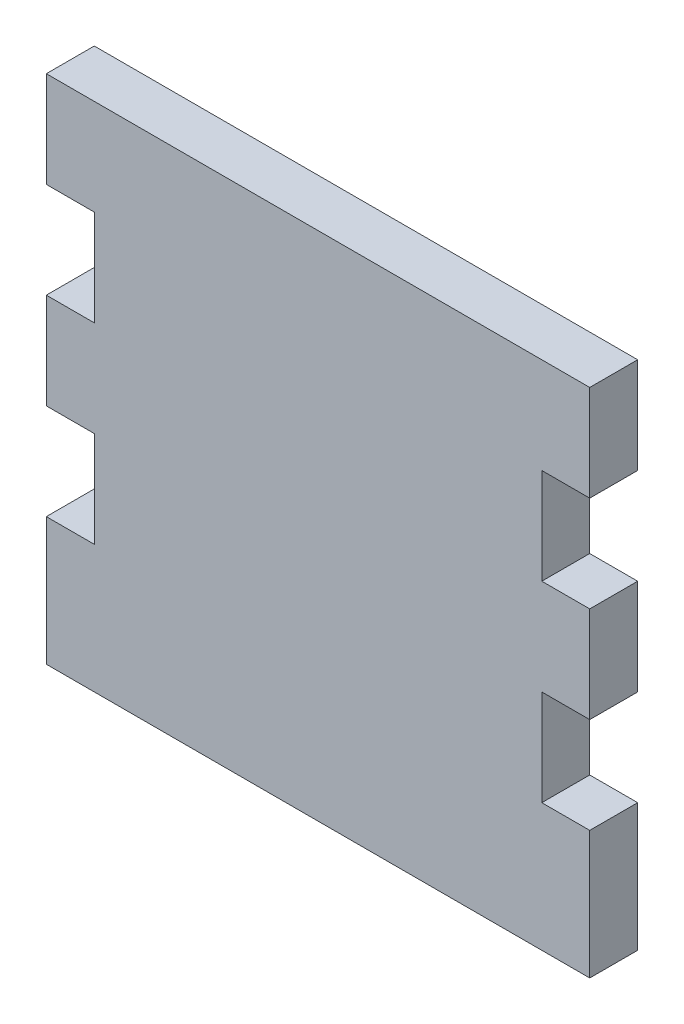
ISO-10303-21;
HEADER;
FILE_DESCRIPTION(('STEP AP214'),'2;1');
FILE_NAME('part.step','',(''),(''),'','','');
FILE_SCHEMA(('AUTOMOTIVE_DESIGN { 1 0 10303 214 1 1 1 1 }'));
ENDSEC;
DATA;
#1=APPLICATION_CONTEXT('core data for automotive mechanical design processes');
#2=APPLICATION_PROTOCOL_DEFINITION('international standard','automotive_design',2000,#1);
#3=PRODUCT_CONTEXT('',#1,'mechanical');
#4=PRODUCT('Part','Part','',(#3));
#5=PRODUCT_RELATED_PRODUCT_CATEGORY('part','',(#4));
#6=PRODUCT_DEFINITION_FORMATION('','',#4);
#7=PRODUCT_DEFINITION_CONTEXT('part definition',#1,'design');
#8=PRODUCT_DEFINITION('design','',#6,#7);
#9=PRODUCT_DEFINITION_SHAPE('','',#8);
#10=(LENGTH_UNIT() NAMED_UNIT(*) SI_UNIT(.MILLI.,.METRE.));
#11=(NAMED_UNIT(*) PLANE_ANGLE_UNIT() SI_UNIT($,.RADIAN.));
#12=(NAMED_UNIT(*) SI_UNIT($,.STERADIAN.) SOLID_ANGLE_UNIT());
#13=UNCERTAINTY_MEASURE_WITH_UNIT(LENGTH_MEASURE(1.E-05),#10,'distance_accuracy_value','');
#14=(GEOMETRIC_REPRESENTATION_CONTEXT(3) GLOBAL_UNCERTAINTY_ASSIGNED_CONTEXT((#13)) GLOBAL_UNIT_ASSIGNED_CONTEXT((#10,
#11,#12)) REPRESENTATION_CONTEXT('',''));
#15=CARTESIAN_POINT('',(0.,0.,0.));
#16=DIRECTION('',(0.,0.,1.));
#17=DIRECTION('',(1.,0.,0.));
#18=AXIS2_PLACEMENT_3D('',#15,#16,#17);
#19=CARTESIAN_POINT('',(-397.263152268225,249.589998968711,15.));
#20=DIRECTION('',(1.,0.,0.));
#21=DIRECTION('',(0.,0.,-1.));
#22=AXIS2_PLACEMENT_3D('',#19,#20,#21);
#23=PLANE('',#22);
#24=DIRECTION('',(0.,-1.,0.));
#25=VECTOR('',#24,1.);
#26=CARTESIAN_POINT('',(-397.263152268225,249.589998968711,0.));
#27=LINE('',#26,#25);
#28=CARTESIAN_POINT('',(-397.263152268225,249.589998968711,0.));
#29=VERTEX_POINT('',#28);
#30=CARTESIAN_POINT('',(-397.263152268225,209.589998968711,0.));
#31=VERTEX_POINT('',#30);
#32=EDGE_CURVE('E203',#29,#31,#27,.T.);
#33=ORIENTED_EDGE('',*,*,#32,.T.);
#34=DIRECTION('',(0.,0.,-1.));
#35=VECTOR('',#34,1.);
#36=CARTESIAN_POINT('',(-397.263152268225,209.589998968711,15.));
#37=LINE('',#36,#35);
#38=CARTESIAN_POINT('',(-397.263152268225,209.589998968711,15.));
#39=VERTEX_POINT('',#38);
#40=EDGE_CURVE('E11',#39,#31,#37,.T.);
#41=ORIENTED_EDGE('',*,*,#40,.F.);
#42=DIRECTION('',(0.,-1.,0.));
#43=VECTOR('',#42,1.);
#44=CARTESIAN_POINT('',(-397.263152268225,249.589998968711,15.));
#45=LINE('',#44,#43);
#46=CARTESIAN_POINT('',(-397.263152268225,249.589998968711,15.));
#47=VERTEX_POINT('',#46);
#48=EDGE_CURVE('E241',#47,#39,#45,.T.);
#49=ORIENTED_EDGE('',*,*,#48,.F.);
#50=DIRECTION('',(0.,0.,-1.));
#51=VECTOR('',#50,1.);
#52=CARTESIAN_POINT('',(-397.263152268225,249.589998968711,15.));
#53=LINE('',#52,#51);
#54=EDGE_CURVE('E199',#47,#29,#53,.T.);
#55=ORIENTED_EDGE('',*,*,#54,.T.);
#56=EDGE_LOOP('',(#33,#41,#49,#55));
#57=FACE_BOUND('',#56,.T.);
#58=ADVANCED_FACE('F35',(#57),#23,.F.);
#59=CARTESIAN_POINT('',(-397.263152268225,209.589998968711,15.));
#60=DIRECTION('',(0.,1.,0.));
#61=DIRECTION('',(0.,0.,1.));
#62=AXIS2_PLACEMENT_3D('',#59,#60,#61);
#63=PLANE('',#62);
#64=DIRECTION('',(1.,0.,0.));
#65=VECTOR('',#64,1.);
#66=CARTESIAN_POINT('',(-397.263152268225,209.589998968711,0.));
#67=LINE('',#66,#65);
#68=CARTESIAN_POINT('',(-227.263152268225,209.589998968711,0.));
#69=VERTEX_POINT('',#68);
#70=EDGE_CURVE('E206',#31,#69,#67,.T.);
#71=ORIENTED_EDGE('',*,*,#70,.T.);
#72=DIRECTION('',(0.,0.,-1.));
#73=VECTOR('',#72,1.);
#74=CARTESIAN_POINT('',(-227.263152268225,209.589998968711,15.));
#75=LINE('',#74,#73);
#76=CARTESIAN_POINT('',(-227.263152268225,209.589998968711,15.));
#77=VERTEX_POINT('',#76);
#78=EDGE_CURVE('E43',#77,#69,#75,.T.);
#79=ORIENTED_EDGE('',*,*,#78,.F.);
#80=DIRECTION('',(1.,0.,0.));
#81=VECTOR('',#80,1.);
#82=CARTESIAN_POINT('',(-397.263152268225,209.589998968711,15.));
#83=LINE('',#82,#81);
#84=EDGE_CURVE('E130',#39,#77,#83,.T.);
#85=ORIENTED_EDGE('',*,*,#84,.F.);
#86=ORIENTED_EDGE('',*,*,#40,.T.);
#87=EDGE_LOOP('',(#71,#79,#85,#86));
#88=FACE_BOUND('',#87,.T.);
#89=ADVANCED_FACE('F359',(#88),#63,.F.);
#90=CARTESIAN_POINT('',(-227.263152268225,209.589998968711,15.));
#91=DIRECTION('',(-1.,0.,0.));
#92=DIRECTION('',(0.,-1.,0.));
#93=AXIS2_PLACEMENT_3D('',#90,#91,#92);
#94=PLANE('',#93);
#95=DIRECTION('',(0.,1.,0.));
#96=VECTOR('',#95,1.);
#97=CARTESIAN_POINT('',(-227.263152268225,209.589998968711,0.));
#98=LINE('',#97,#96);
#99=CARTESIAN_POINT('',(-227.263152268225,249.589998968711,0.));
#100=VERTEX_POINT('',#99);
#101=EDGE_CURVE('E208',#69,#100,#98,.T.);
#102=ORIENTED_EDGE('',*,*,#101,.T.);
#103=DIRECTION('',(0.,0.,-1.));
#104=VECTOR('',#103,1.);
#105=CARTESIAN_POINT('',(-227.263152268225,249.589998968711,15.));
#106=LINE('',#105,#104);
#107=CARTESIAN_POINT('',(-227.263152268225,249.589998968711,15.));
#108=VERTEX_POINT('',#107);
#109=EDGE_CURVE('E284',#108,#100,#106,.T.);
#110=ORIENTED_EDGE('',*,*,#109,.F.);
#111=DIRECTION('',(0.,1.,0.));
#112=VECTOR('',#111,1.);
#113=CARTESIAN_POINT('',(-227.263152268225,209.589998968711,15.));
#114=LINE('',#113,#112);
#115=EDGE_CURVE('E292',#77,#108,#114,.T.);
#116=ORIENTED_EDGE('',*,*,#115,.F.);
#117=ORIENTED_EDGE('',*,*,#78,.T.);
#118=EDGE_LOOP('',(#102,#110,#116,#117));
#119=FACE_BOUND('',#118,.T.);
#120=ADVANCED_FACE('F290',(#119),#94,.F.);
#121=CARTESIAN_POINT('',(-227.263152268225,249.589998968711,15.));
#122=DIRECTION('',(0.,-1.,0.));
#123=DIRECTION('',(0.,0.,-1.));
#124=AXIS2_PLACEMENT_3D('',#121,#122,#123);
#125=PLANE('',#124);
#126=DIRECTION('',(-1.,0.,0.));
#127=VECTOR('',#126,1.);
#128=CARTESIAN_POINT('',(-227.263152268225,249.589998968711,0.));
#129=LINE('',#128,#127);
#130=CARTESIAN_POINT('',(-242.263152268225,249.589998968711,0.));
#131=VERTEX_POINT('',#130);
#132=EDGE_CURVE('E210',#100,#131,#129,.T.);
#133=ORIENTED_EDGE('',*,*,#132,.T.);
#134=DIRECTION('',(0.,0.,-1.));
#135=VECTOR('',#134,1.);
#136=CARTESIAN_POINT('',(-242.263152268225,249.589998968711,15.));
#137=LINE('',#136,#135);
#138=CARTESIAN_POINT('',(-242.263152268225,249.589998968711,15.));
#139=VERTEX_POINT('',#138);
#140=EDGE_CURVE('E281',#139,#131,#137,.T.);
#141=ORIENTED_EDGE('',*,*,#140,.F.);
#142=DIRECTION('',(-1.,0.,0.));
#143=VECTOR('',#142,1.);
#144=CARTESIAN_POINT('',(-227.263152268225,249.589998968711,15.));
#145=LINE('',#144,#143);
#146=EDGE_CURVE('E310',#108,#139,#145,.T.);
#147=ORIENTED_EDGE('',*,*,#146,.F.);
#148=ORIENTED_EDGE('',*,*,#109,.T.);
#149=EDGE_LOOP('',(#133,#141,#147,#148));
#150=FACE_BOUND('',#149,.T.);
#151=ADVANCED_FACE('F301',(#150),#125,.F.);
#152=CARTESIAN_POINT('',(-242.263152268225,249.589998968711,15.));
#153=DIRECTION('',(-1.,0.,0.));
#154=DIRECTION('',(0.,0.,1.));
#155=AXIS2_PLACEMENT_3D('',#152,#153,#154);
#156=PLANE('',#155);
#157=DIRECTION('',(0.,1.,0.));
#158=VECTOR('',#157,1.);
#159=CARTESIAN_POINT('',(-242.263152268225,249.589998968711,0.));
#160=LINE('',#159,#158);
#161=CARTESIAN_POINT('',(-242.263152268225,279.589998968711,0.));
#162=VERTEX_POINT('',#161);
#163=EDGE_CURVE('E212',#131,#162,#160,.T.);
#164=ORIENTED_EDGE('',*,*,#163,.T.);
#165=DIRECTION('',(0.,0.,-1.));
#166=VECTOR('',#165,1.);
#167=CARTESIAN_POINT('',(-242.263152268225,279.589998968711,15.));
#168=LINE('',#167,#166);
#169=CARTESIAN_POINT('',(-242.263152268225,279.589998968711,15.));
#170=VERTEX_POINT('',#169);
#171=EDGE_CURVE('E278',#170,#162,#168,.T.);
#172=ORIENTED_EDGE('',*,*,#171,.F.);
#173=DIRECTION('',(0.,1.,0.));
#174=VECTOR('',#173,1.);
#175=CARTESIAN_POINT('',(-242.263152268225,249.589998968711,15.));
#176=LINE('',#175,#174);
#177=EDGE_CURVE('E307',#139,#170,#176,.T.);
#178=ORIENTED_EDGE('',*,*,#177,.F.);
#179=ORIENTED_EDGE('',*,*,#140,.T.);
#180=EDGE_LOOP('',(#164,#172,#178,#179));
#181=FACE_BOUND('',#180,.T.);
#182=ADVANCED_FACE('F305',(#181),#156,.F.);
#183=CARTESIAN_POINT('',(-242.263152268225,279.589998968711,15.));
#184=DIRECTION('',(0.,1.,0.));
#185=DIRECTION('',(0.,0.,1.));
#186=AXIS2_PLACEMENT_3D('',#183,#184,#185);
#187=PLANE('',#186);
#188=DIRECTION('',(1.,0.,0.));
#189=VECTOR('',#188,1.);
#190=CARTESIAN_POINT('',(-242.263152268225,279.589998968711,0.));
#191=LINE('',#190,#189);
#192=CARTESIAN_POINT('',(-227.263152268225,279.589998968711,0.));
#193=VERTEX_POINT('',#192);
#194=EDGE_CURVE('E214',#162,#193,#191,.T.);
#195=ORIENTED_EDGE('',*,*,#194,.T.);
#196=DIRECTION('',(0.,0.,-1.));
#197=VECTOR('',#196,1.);
#198=CARTESIAN_POINT('',(-227.263152268225,279.589998968711,15.));
#199=LINE('',#198,#197);
#200=CARTESIAN_POINT('',(-227.263152268225,279.589998968711,15.));
#201=VERTEX_POINT('',#200);
#202=EDGE_CURVE('E275',#201,#193,#199,.T.);
#203=ORIENTED_EDGE('',*,*,#202,.F.);
#204=DIRECTION('',(1.,0.,0.));
#205=VECTOR('',#204,1.);
#206=CARTESIAN_POINT('',(-242.263152268225,279.589998968711,15.));
#207=LINE('',#206,#205);
#208=EDGE_CURVE('E309',#170,#201,#207,.T.);
#209=ORIENTED_EDGE('',*,*,#208,.F.);
#210=ORIENTED_EDGE('',*,*,#171,.T.);
#211=EDGE_LOOP('',(#195,#203,#209,#210));
#212=FACE_BOUND('',#211,.T.);
#213=ADVANCED_FACE('F372',(#212),#187,.F.);
#214=CARTESIAN_POINT('',(-227.263152268225,279.589998968711,15.));
#215=DIRECTION('',(-1.,0.,0.));
#216=DIRECTION('',(0.,0.,1.));
#217=AXIS2_PLACEMENT_3D('',#214,#215,#216);
#218=PLANE('',#217);
#219=DIRECTION('',(0.,1.,0.));
#220=VECTOR('',#219,1.);
#221=CARTESIAN_POINT('',(-227.263152268225,279.589998968711,0.));
#222=LINE('',#221,#220);
#223=CARTESIAN_POINT('',(-227.263152268225,309.589998968711,0.));
#224=VERTEX_POINT('',#223);
#225=EDGE_CURVE('E216',#193,#224,#222,.T.);
#226=ORIENTED_EDGE('',*,*,#225,.T.);
#227=DIRECTION('',(0.,0.,-1.));
#228=VECTOR('',#227,1.);
#229=CARTESIAN_POINT('',(-227.263152268225,309.589998968711,15.));
#230=LINE('',#229,#228);
#231=CARTESIAN_POINT('',(-227.263152268225,309.589998968711,15.));
#232=VERTEX_POINT('',#231);
#233=EDGE_CURVE('E272',#232,#224,#230,.T.);
#234=ORIENTED_EDGE('',*,*,#233,.F.);
#235=DIRECTION('',(0.,1.,0.));
#236=VECTOR('',#235,1.);
#237=CARTESIAN_POINT('',(-227.263152268225,279.589998968711,15.));
#238=LINE('',#237,#236);
#239=EDGE_CURVE('E312',#201,#232,#238,.T.);
#240=ORIENTED_EDGE('',*,*,#239,.F.);
#241=ORIENTED_EDGE('',*,*,#202,.T.);
#242=EDGE_LOOP('',(#226,#234,#240,#241));
#243=FACE_BOUND('',#242,.T.);
#244=ADVANCED_FACE('F375',(#243),#218,.F.);
#245=CARTESIAN_POINT('',(-227.263152268225,309.589998968711,15.));
#246=DIRECTION('',(0.,-1.,0.));
#247=DIRECTION('',(0.,0.,-1.));
#248=AXIS2_PLACEMENT_3D('',#245,#246,#247);
#249=PLANE('',#248);
#250=DIRECTION('',(-1.,0.,0.));
#251=VECTOR('',#250,1.);
#252=CARTESIAN_POINT('',(-227.263152268225,309.589998968711,0.));
#253=LINE('',#252,#251);
#254=CARTESIAN_POINT('',(-242.263152268225,309.589998968711,0.));
#255=VERTEX_POINT('',#254);
#256=EDGE_CURVE('E218',#224,#255,#253,.T.);
#257=ORIENTED_EDGE('',*,*,#256,.T.);
#258=DIRECTION('',(0.,0.,-1.));
#259=VECTOR('',#258,1.);
#260=CARTESIAN_POINT('',(-242.263152268225,309.589998968711,15.));
#261=LINE('',#260,#259);
#262=CARTESIAN_POINT('',(-242.263152268225,309.589998968711,15.));
#263=VERTEX_POINT('',#262);
#264=EDGE_CURVE('E269',#263,#255,#261,.T.);
#265=ORIENTED_EDGE('',*,*,#264,.F.);
#266=DIRECTION('',(-1.,0.,0.));
#267=VECTOR('',#266,1.);
#268=CARTESIAN_POINT('',(-227.263152268225,309.589998968711,15.));
#269=LINE('',#268,#267);
#270=EDGE_CURVE('E318',#232,#263,#269,.T.);
#271=ORIENTED_EDGE('',*,*,#270,.F.);
#272=ORIENTED_EDGE('',*,*,#233,.T.);
#273=EDGE_LOOP('',(#257,#265,#271,#272));
#274=FACE_BOUND('',#273,.T.);
#275=ADVANCED_FACE('F379',(#274),#249,.F.);
#276=CARTESIAN_POINT('',(-242.263152268225,309.589998968711,15.));
#277=DIRECTION('',(-1.,0.,0.));
#278=DIRECTION('',(0.,0.,1.));
#279=AXIS2_PLACEMENT_3D('',#276,#277,#278);
#280=PLANE('',#279);
#281=DIRECTION('',(0.,1.,0.));
#282=VECTOR('',#281,1.);
#283=CARTESIAN_POINT('',(-242.263152268225,309.589998968711,0.));
#284=LINE('',#283,#282);
#285=CARTESIAN_POINT('',(-242.263152268225,339.589998968711,0.));
#286=VERTEX_POINT('',#285);
#287=EDGE_CURVE('E220',#255,#286,#284,.T.);
#288=ORIENTED_EDGE('',*,*,#287,.T.);
#289=DIRECTION('',(0.,0.,-1.));
#290=VECTOR('',#289,1.);
#291=CARTESIAN_POINT('',(-242.263152268225,339.589998968711,15.));
#292=LINE('',#291,#290);
#293=CARTESIAN_POINT('',(-242.263152268225,339.589998968711,15.));
#294=VERTEX_POINT('',#293);
#295=EDGE_CURVE('E266',#294,#286,#292,.T.);
#296=ORIENTED_EDGE('',*,*,#295,.F.);
#297=DIRECTION('',(0.,1.,0.));
#298=VECTOR('',#297,1.);
#299=CARTESIAN_POINT('',(-242.263152268225,309.589998968711,15.));
#300=LINE('',#299,#298);
#301=EDGE_CURVE('E320',#263,#294,#300,.T.);
#302=ORIENTED_EDGE('',*,*,#301,.F.);
#303=ORIENTED_EDGE('',*,*,#264,.T.);
#304=EDGE_LOOP('',(#288,#296,#302,#303));
#305=FACE_BOUND('',#304,.T.);
#306=ADVANCED_FACE('F383',(#305),#280,.F.);
#307=CARTESIAN_POINT('',(-242.263152268225,339.589998968711,15.));
#308=DIRECTION('',(0.,1.,0.));
#309=DIRECTION('',(0.,0.,1.));
#310=AXIS2_PLACEMENT_3D('',#307,#308,#309);
#311=PLANE('',#310);
#312=DIRECTION('',(1.,0.,0.));
#313=VECTOR('',#312,1.);
#314=CARTESIAN_POINT('',(-242.263152268225,339.589998968711,0.));
#315=LINE('',#314,#313);
#316=CARTESIAN_POINT('',(-227.263152268225,339.589998968711,0.));
#317=VERTEX_POINT('',#316);
#318=EDGE_CURVE('E222',#286,#317,#315,.T.);
#319=ORIENTED_EDGE('',*,*,#318,.T.);
#320=DIRECTION('',(0.,0.,-1.));
#321=VECTOR('',#320,1.);
#322=CARTESIAN_POINT('',(-227.263152268225,339.589998968711,15.));
#323=LINE('',#322,#321);
#324=CARTESIAN_POINT('',(-227.263152268225,339.589998968711,15.));
#325=VERTEX_POINT('',#324);
#326=EDGE_CURVE('E263',#325,#317,#323,.T.);
#327=ORIENTED_EDGE('',*,*,#326,.F.);
#328=DIRECTION('',(1.,0.,0.));
#329=VECTOR('',#328,1.);
#330=CARTESIAN_POINT('',(-242.263152268225,339.589998968711,15.));
#331=LINE('',#330,#329);
#332=EDGE_CURVE('E322',#294,#325,#331,.T.);
#333=ORIENTED_EDGE('',*,*,#332,.F.);
#334=ORIENTED_EDGE('',*,*,#295,.T.);
#335=EDGE_LOOP('',(#319,#327,#333,#334));
#336=FACE_BOUND('',#335,.T.);
#337=ADVANCED_FACE('F387',(#336),#311,.F.);
#338=CARTESIAN_POINT('',(-227.263152268225,339.589998968711,15.));
#339=DIRECTION('',(-1.,0.,0.));
#340=DIRECTION('',(0.,-1.,0.));
#341=AXIS2_PLACEMENT_3D('',#338,#339,#340);
#342=PLANE('',#341);
#343=DIRECTION('',(0.,1.,0.));
#344=VECTOR('',#343,1.);
#345=CARTESIAN_POINT('',(-227.263152268225,339.589998968711,0.));
#346=LINE('',#345,#344);
#347=CARTESIAN_POINT('',(-227.263152268225,369.589998968711,0.));
#348=VERTEX_POINT('',#347);
#349=EDGE_CURVE('E224',#317,#348,#346,.T.);
#350=ORIENTED_EDGE('',*,*,#349,.T.);
#351=DIRECTION('',(0.,0.,-1.));
#352=VECTOR('',#351,1.);
#353=CARTESIAN_POINT('',(-227.263152268225,369.589998968711,15.));
#354=LINE('',#353,#352);
#355=CARTESIAN_POINT('',(-227.263152268225,369.589998968711,15.));
#356=VERTEX_POINT('',#355);
#357=EDGE_CURVE('E260',#356,#348,#354,.T.);
#358=ORIENTED_EDGE('',*,*,#357,.F.);
#359=DIRECTION('',(0.,1.,0.));
#360=VECTOR('',#359,1.);
#361=CARTESIAN_POINT('',(-227.263152268225,339.589998968711,15.));
#362=LINE('',#361,#360);
#363=EDGE_CURVE('E324',#325,#356,#362,.T.);
#364=ORIENTED_EDGE('',*,*,#363,.F.);
#365=ORIENTED_EDGE('',*,*,#326,.T.);
#366=EDGE_LOOP('',(#350,#358,#364,#365));
#367=FACE_BOUND('',#366,.T.);
#368=ADVANCED_FACE('F391',(#367),#342,.F.);
#369=CARTESIAN_POINT('',(-397.263152268225,369.589998968711,15.));
#370=DIRECTION('',(0.,-1.,0.));
#371=DIRECTION('',(0.,0.,-1.));
#372=AXIS2_PLACEMENT_3D('',#369,#370,#371);
#373=PLANE('',#372);
#374=DIRECTION('',(-1.,0.,0.));
#375=VECTOR('',#374,1.);
#376=CARTESIAN_POINT('',(-397.263152268225,369.589998968711,0.));
#377=LINE('',#376,#375);
#378=CARTESIAN_POINT('',(-397.263152268225,369.589998968711,0.));
#379=VERTEX_POINT('',#378);
#380=EDGE_CURVE('E226',#348,#379,#377,.T.);
#381=ORIENTED_EDGE('',*,*,#380,.T.);
#382=DIRECTION('',(0.,0.,-1.));
#383=VECTOR('',#382,1.);
#384=CARTESIAN_POINT('',(-397.263152268225,369.589998968711,15.));
#385=LINE('',#384,#383);
#386=CARTESIAN_POINT('',(-397.263152268225,369.589998968711,15.));
#387=VERTEX_POINT('',#386);
#388=EDGE_CURVE('E257',#387,#379,#385,.T.);
#389=ORIENTED_EDGE('',*,*,#388,.F.);
#390=DIRECTION('',(-1.,0.,0.));
#391=VECTOR('',#390,1.);
#392=CARTESIAN_POINT('',(-397.263152268225,369.589998968711,15.));
#393=LINE('',#392,#391);
#394=EDGE_CURVE('E326',#356,#387,#393,.T.);
#395=ORIENTED_EDGE('',*,*,#394,.F.);
#396=ORIENTED_EDGE('',*,*,#357,.T.);
#397=EDGE_LOOP('',(#381,#389,#395,#396));
#398=FACE_BOUND('',#397,.T.);
#399=ADVANCED_FACE('F395',(#398),#373,.F.);
#400=CARTESIAN_POINT('',(-397.263152268225,339.589998968711,15.));
#401=DIRECTION('',(1.,0.,0.));
#402=DIRECTION('',(0.,0.,-1.));
#403=AXIS2_PLACEMENT_3D('',#400,#401,#402);
#404=PLANE('',#403);
#405=DIRECTION('',(0.,-1.,0.));
#406=VECTOR('',#405,1.);
#407=CARTESIAN_POINT('',(-397.263152268225,339.589998968711,0.));
#408=LINE('',#407,#406);
#409=CARTESIAN_POINT('',(-397.263152268225,339.589998968711,0.));
#410=VERTEX_POINT('',#409);
#411=EDGE_CURVE('E228',#379,#410,#408,.T.);
#412=ORIENTED_EDGE('',*,*,#411,.T.);
#413=DIRECTION('',(0.,0.,-1.));
#414=VECTOR('',#413,1.);
#415=CARTESIAN_POINT('',(-397.263152268225,339.589998968711,15.));
#416=LINE('',#415,#414);
#417=CARTESIAN_POINT('',(-397.263152268225,339.589998968711,15.));
#418=VERTEX_POINT('',#417);
#419=EDGE_CURVE('E254',#418,#410,#416,.T.);
#420=ORIENTED_EDGE('',*,*,#419,.F.);
#421=DIRECTION('',(0.,-1.,0.));
#422=VECTOR('',#421,1.);
#423=CARTESIAN_POINT('',(-397.263152268225,339.589998968711,15.));
#424=LINE('',#423,#422);
#425=EDGE_CURVE('E328',#387,#418,#424,.T.);
#426=ORIENTED_EDGE('',*,*,#425,.F.);
#427=ORIENTED_EDGE('',*,*,#388,.T.);
#428=EDGE_LOOP('',(#412,#420,#426,#427));
#429=FACE_BOUND('',#428,.T.);
#430=ADVANCED_FACE('F399',(#429),#404,.F.);
#431=CARTESIAN_POINT('',(-382.263152268225,339.589998968711,15.));
#432=DIRECTION('',(0.,1.,0.));
#433=DIRECTION('',(0.,0.,1.));
#434=AXIS2_PLACEMENT_3D('',#431,#432,#433);
#435=PLANE('',#434);
#436=DIRECTION('',(1.,0.,0.));
#437=VECTOR('',#436,1.);
#438=CARTESIAN_POINT('',(-382.263152268225,339.589998968711,0.));
#439=LINE('',#438,#437);
#440=CARTESIAN_POINT('',(-382.263152268225,339.589998968711,0.));
#441=VERTEX_POINT('',#440);
#442=EDGE_CURVE('E230',#410,#441,#439,.T.);
#443=ORIENTED_EDGE('',*,*,#442,.T.);
#444=DIRECTION('',(0.,0.,-1.));
#445=VECTOR('',#444,1.);
#446=CARTESIAN_POINT('',(-382.263152268225,339.589998968711,15.));
#447=LINE('',#446,#445);
#448=CARTESIAN_POINT('',(-382.263152268225,339.589998968711,15.));
#449=VERTEX_POINT('',#448);
#450=EDGE_CURVE('E251',#449,#441,#447,.T.);
#451=ORIENTED_EDGE('',*,*,#450,.F.);
#452=DIRECTION('',(1.,0.,0.));
#453=VECTOR('',#452,1.);
#454=CARTESIAN_POINT('',(-382.263152268225,339.589998968711,15.));
#455=LINE('',#454,#453);
#456=EDGE_CURVE('E330',#418,#449,#455,.T.);
#457=ORIENTED_EDGE('',*,*,#456,.F.);
#458=ORIENTED_EDGE('',*,*,#419,.T.);
#459=EDGE_LOOP('',(#443,#451,#457,#458));
#460=FACE_BOUND('',#459,.T.);
#461=ADVANCED_FACE('F403',(#460),#435,.F.);
#462=CARTESIAN_POINT('',(-382.263152268225,309.589998968711,15.));
#463=DIRECTION('',(1.,0.,0.));
#464=DIRECTION('',(0.,0.,-1.));
#465=AXIS2_PLACEMENT_3D('',#462,#463,#464);
#466=PLANE('',#465);
#467=DIRECTION('',(0.,-1.,0.));
#468=VECTOR('',#467,1.);
#469=CARTESIAN_POINT('',(-382.263152268225,309.589998968711,0.));
#470=LINE('',#469,#468);
#471=CARTESIAN_POINT('',(-382.263152268225,309.589998968711,0.));
#472=VERTEX_POINT('',#471);
#473=EDGE_CURVE('E232',#441,#472,#470,.T.);
#474=ORIENTED_EDGE('',*,*,#473,.T.);
#475=DIRECTION('',(0.,0.,-1.));
#476=VECTOR('',#475,1.);
#477=CARTESIAN_POINT('',(-382.263152268225,309.589998968711,15.));
#478=LINE('',#477,#476);
#479=CARTESIAN_POINT('',(-382.263152268225,309.589998968711,15.));
#480=VERTEX_POINT('',#479);
#481=EDGE_CURVE('E248',#480,#472,#478,.T.);
#482=ORIENTED_EDGE('',*,*,#481,.F.);
#483=DIRECTION('',(0.,-1.,0.));
#484=VECTOR('',#483,1.);
#485=CARTESIAN_POINT('',(-382.263152268225,309.589998968711,15.));
#486=LINE('',#485,#484);
#487=EDGE_CURVE('E332',#449,#480,#486,.T.);
#488=ORIENTED_EDGE('',*,*,#487,.F.);
#489=ORIENTED_EDGE('',*,*,#450,.T.);
#490=EDGE_LOOP('',(#474,#482,#488,#489));
#491=FACE_BOUND('',#490,.T.);
#492=ADVANCED_FACE('F407',(#491),#466,.F.);
#493=CARTESIAN_POINT('',(-397.263152268225,309.589998968711,15.));
#494=DIRECTION('',(0.,-1.,0.));
#495=DIRECTION('',(0.,0.,-1.));
#496=AXIS2_PLACEMENT_3D('',#493,#494,#495);
#497=PLANE('',#496);
#498=DIRECTION('',(-1.,0.,0.));
#499=VECTOR('',#498,1.);
#500=CARTESIAN_POINT('',(-397.263152268225,309.589998968711,0.));
#501=LINE('',#500,#499);
#502=CARTESIAN_POINT('',(-397.263152268225,309.589998968711,0.));
#503=VERTEX_POINT('',#502);
#504=EDGE_CURVE('E234',#472,#503,#501,.T.);
#505=ORIENTED_EDGE('',*,*,#504,.T.);
#506=DIRECTION('',(0.,0.,-1.));
#507=VECTOR('',#506,1.);
#508=CARTESIAN_POINT('',(-397.263152268225,309.589998968711,15.));
#509=LINE('',#508,#507);
#510=CARTESIAN_POINT('',(-397.263152268225,309.589998968711,15.));
#511=VERTEX_POINT('',#510);
#512=EDGE_CURVE('E245',#511,#503,#509,.T.);
#513=ORIENTED_EDGE('',*,*,#512,.F.);
#514=DIRECTION('',(-1.,0.,0.));
#515=VECTOR('',#514,1.);
#516=CARTESIAN_POINT('',(-397.263152268225,309.589998968711,15.));
#517=LINE('',#516,#515);
#518=EDGE_CURVE('E334',#480,#511,#517,.T.);
#519=ORIENTED_EDGE('',*,*,#518,.F.);
#520=ORIENTED_EDGE('',*,*,#481,.T.);
#521=EDGE_LOOP('',(#505,#513,#519,#520));
#522=FACE_BOUND('',#521,.T.);
#523=ADVANCED_FACE('F340',(#522),#497,.F.);
#524=CARTESIAN_POINT('',(-397.263152268225,279.589998968711,15.));
#525=DIRECTION('',(1.,0.,0.));
#526=DIRECTION('',(0.,0.,-1.));
#527=AXIS2_PLACEMENT_3D('',#524,#525,#526);
#528=PLANE('',#527);
#529=DIRECTION('',(0.,-1.,0.));
#530=VECTOR('',#529,1.);
#531=CARTESIAN_POINT('',(-397.263152268225,279.589998968711,0.));
#532=LINE('',#531,#530);
#533=CARTESIAN_POINT('',(-397.263152268225,279.589998968711,0.));
#534=VERTEX_POINT('',#533);
#535=EDGE_CURVE('E236',#503,#534,#532,.T.);
#536=ORIENTED_EDGE('',*,*,#535,.T.);
#537=DIRECTION('',(0.,0.,-1.));
#538=VECTOR('',#537,1.);
#539=CARTESIAN_POINT('',(-397.263152268225,279.589998968711,15.));
#540=LINE('',#539,#538);
#541=CARTESIAN_POINT('',(-397.263152268225,279.589998968711,15.));
#542=VERTEX_POINT('',#541);
#543=EDGE_CURVE('E194',#542,#534,#540,.T.);
#544=ORIENTED_EDGE('',*,*,#543,.F.);
#545=DIRECTION('',(0.,-1.,0.));
#546=VECTOR('',#545,1.);
#547=CARTESIAN_POINT('',(-397.263152268225,279.589998968711,15.));
#548=LINE('',#547,#546);
#549=EDGE_CURVE('E185',#511,#542,#548,.T.);
#550=ORIENTED_EDGE('',*,*,#549,.F.);
#551=ORIENTED_EDGE('',*,*,#512,.T.);
#552=EDGE_LOOP('',(#536,#544,#550,#551));
#553=FACE_BOUND('',#552,.T.);
#554=ADVANCED_FACE('F344',(#553),#528,.F.);
#555=CARTESIAN_POINT('',(-382.263152268225,279.589998968711,15.));
#556=DIRECTION('',(0.,1.,0.));
#557=DIRECTION('',(0.,0.,1.));
#558=AXIS2_PLACEMENT_3D('',#555,#556,#557);
#559=PLANE('',#558);
#560=DIRECTION('',(1.,0.,0.));
#561=VECTOR('',#560,1.);
#562=CARTESIAN_POINT('',(-382.263152268225,279.589998968711,0.));
#563=LINE('',#562,#561);
#564=CARTESIAN_POINT('',(-382.263152268225,279.589998968711,0.));
#565=VERTEX_POINT('',#564);
#566=EDGE_CURVE('E193',#534,#565,#563,.T.);
#567=ORIENTED_EDGE('',*,*,#566,.T.);
#568=DIRECTION('',(0.,0.,-1.));
#569=VECTOR('',#568,1.);
#570=CARTESIAN_POINT('',(-382.263152268225,279.589998968711,15.));
#571=LINE('',#570,#569);
#572=CARTESIAN_POINT('',(-382.263152268225,279.589998968711,15.));
#573=VERTEX_POINT('',#572);
#574=EDGE_CURVE('E190',#573,#565,#571,.T.);
#575=ORIENTED_EDGE('',*,*,#574,.F.);
#576=DIRECTION('',(1.,0.,0.));
#577=VECTOR('',#576,1.);
#578=CARTESIAN_POINT('',(-382.263152268225,279.589998968711,15.));
#579=LINE('',#578,#577);
#580=EDGE_CURVE('E179',#542,#573,#579,.T.);
#581=ORIENTED_EDGE('',*,*,#580,.F.);
#582=ORIENTED_EDGE('',*,*,#543,.T.);
#583=EDGE_LOOP('',(#567,#575,#581,#582));
#584=FACE_BOUND('',#583,.T.);
#585=ADVANCED_FACE('F191',(#584),#559,.F.);
#586=CARTESIAN_POINT('',(-382.263152268225,249.589998968711,15.));
#587=DIRECTION('',(1.,0.,0.));
#588=DIRECTION('',(0.,0.,-1.));
#589=AXIS2_PLACEMENT_3D('',#586,#587,#588);
#590=PLANE('',#589);
#591=DIRECTION('',(0.,-1.,0.));
#592=VECTOR('',#591,1.);
#593=CARTESIAN_POINT('',(-382.263152268225,249.589998968711,0.));
#594=LINE('',#593,#592);
#595=CARTESIAN_POINT('',(-382.263152268225,249.589998968711,0.));
#596=VERTEX_POINT('',#595);
#597=EDGE_CURVE('E116',#565,#596,#594,.T.);
#598=ORIENTED_EDGE('',*,*,#597,.T.);
#599=DIRECTION('',(0.,0.,-1.));
#600=VECTOR('',#599,1.);
#601=CARTESIAN_POINT('',(-382.263152268225,249.589998968711,15.));
#602=LINE('',#601,#600);
#603=CARTESIAN_POINT('',(-382.263152268225,249.589998968711,15.));
#604=VERTEX_POINT('',#603);
#605=EDGE_CURVE('E195',#604,#596,#602,.T.);
#606=ORIENTED_EDGE('',*,*,#605,.F.);
#607=DIRECTION('',(0.,-1.,0.));
#608=VECTOR('',#607,1.);
#609=CARTESIAN_POINT('',(-382.263152268225,249.589998968711,15.));
#610=LINE('',#609,#608);
#611=EDGE_CURVE('E183',#573,#604,#610,.T.);
#612=ORIENTED_EDGE('',*,*,#611,.F.);
#613=ORIENTED_EDGE('',*,*,#574,.T.);
#614=EDGE_LOOP('',(#598,#606,#612,#613));
#615=FACE_BOUND('',#614,.T.);
#616=ADVANCED_FACE('F197',(#615),#590,.F.);
#617=CARTESIAN_POINT('',(-397.263152268225,249.589998968711,15.));
#618=DIRECTION('',(0.,-1.,0.));
#619=DIRECTION('',(0.,0.,-1.));
#620=AXIS2_PLACEMENT_3D('',#617,#618,#619);
#621=PLANE('',#620);
#622=DIRECTION('',(-1.,0.,0.));
#623=VECTOR('',#622,1.);
#624=CARTESIAN_POINT('',(-397.263152268225,249.589998968711,0.));
#625=LINE('',#624,#623);
#626=EDGE_CURVE('E122',#596,#29,#625,.T.);
#627=ORIENTED_EDGE('',*,*,#626,.T.);
#628=ORIENTED_EDGE('',*,*,#54,.F.);
#629=DIRECTION('',(-1.,0.,0.));
#630=VECTOR('',#629,1.);
#631=CARTESIAN_POINT('',(-397.263152268225,249.589998968711,15.));
#632=LINE('',#631,#630);
#633=EDGE_CURVE('E51',#604,#47,#632,.T.);
#634=ORIENTED_EDGE('',*,*,#633,.F.);
#635=ORIENTED_EDGE('',*,*,#605,.T.);
#636=EDGE_LOOP('',(#627,#628,#634,#635));
#637=FACE_BOUND('',#636,.T.);
#638=ADVANCED_FACE('F348',(#637),#621,.F.);
#639=CARTESIAN_POINT('',(0.,0.,15.));
#640=DIRECTION('',(0.,0.,1.));
#641=DIRECTION('',(1.,0.,0.));
#642=AXIS2_PLACEMENT_3D('',#639,#640,#641);
#643=PLANE('',#642);
#644=ORIENTED_EDGE('',*,*,#48,.T.);
#645=ORIENTED_EDGE('',*,*,#84,.T.);
#646=ORIENTED_EDGE('',*,*,#115,.T.);
#647=ORIENTED_EDGE('',*,*,#146,.T.);
#648=ORIENTED_EDGE('',*,*,#177,.T.);
#649=ORIENTED_EDGE('',*,*,#208,.T.);
#650=ORIENTED_EDGE('',*,*,#239,.T.);
#651=ORIENTED_EDGE('',*,*,#270,.T.);
#652=ORIENTED_EDGE('',*,*,#301,.T.);
#653=ORIENTED_EDGE('',*,*,#332,.T.);
#654=ORIENTED_EDGE('',*,*,#363,.T.);
#655=ORIENTED_EDGE('',*,*,#394,.T.);
#656=ORIENTED_EDGE('',*,*,#425,.T.);
#657=ORIENTED_EDGE('',*,*,#456,.T.);
#658=ORIENTED_EDGE('',*,*,#487,.T.);
#659=ORIENTED_EDGE('',*,*,#518,.T.);
#660=ORIENTED_EDGE('',*,*,#549,.T.);
#661=ORIENTED_EDGE('',*,*,#580,.T.);
#662=ORIENTED_EDGE('',*,*,#611,.T.);
#663=ORIENTED_EDGE('',*,*,#633,.T.);
#664=EDGE_LOOP('',(#644,#645,#646,#647,#648,#649,#650,#651,#652,#653,#654,#655,#656,#657,#658,
#659,#660,#661,#662,#663));
#665=FACE_BOUND('',#664,.T.);
#666=ADVANCED_FACE('F181',(#665),#643,.T.);
#667=CARTESIAN_POINT('',(0.,0.,0.));
#668=DIRECTION('',(0.,0.,1.));
#669=DIRECTION('',(1.,0.,0.));
#670=AXIS2_PLACEMENT_3D('',#667,#668,#669);
#671=PLANE('',#670);
#672=ORIENTED_EDGE('',*,*,#32,.F.);
#673=ORIENTED_EDGE('',*,*,#626,.F.);
#674=ORIENTED_EDGE('',*,*,#597,.F.);
#675=ORIENTED_EDGE('',*,*,#566,.F.);
#676=ORIENTED_EDGE('',*,*,#535,.F.);
#677=ORIENTED_EDGE('',*,*,#504,.F.);
#678=ORIENTED_EDGE('',*,*,#473,.F.);
#679=ORIENTED_EDGE('',*,*,#442,.F.);
#680=ORIENTED_EDGE('',*,*,#411,.F.);
#681=ORIENTED_EDGE('',*,*,#380,.F.);
#682=ORIENTED_EDGE('',*,*,#349,.F.);
#683=ORIENTED_EDGE('',*,*,#318,.F.);
#684=ORIENTED_EDGE('',*,*,#287,.F.);
#685=ORIENTED_EDGE('',*,*,#256,.F.);
#686=ORIENTED_EDGE('',*,*,#225,.F.);
#687=ORIENTED_EDGE('',*,*,#194,.F.);
#688=ORIENTED_EDGE('',*,*,#163,.F.);
#689=ORIENTED_EDGE('',*,*,#132,.F.);
#690=ORIENTED_EDGE('',*,*,#101,.F.);
#691=ORIENTED_EDGE('',*,*,#70,.F.);
#692=EDGE_LOOP('',(#672,#673,#674,#675,#676,#677,#678,#679,#680,#681,#682,#683,#684,#685,#686,
#687,#688,#689,#690,#691));
#693=FACE_BOUND('',#692,.T.);
#694=ADVANCED_FACE('F296',(#693),#671,.F.);
#695=CLOSED_SHELL('',(#58,#89,#120,#151,#182,#213,#244,#275,#306,#337,#368,#399,#430,#461,#492,
#523,#554,#585,#616,#638,#666,#694));
#696=MANIFOLD_SOLID_BREP('B2',#695);
#697=ADVANCED_BREP_SHAPE_REPRESENTATION('',(#18,#696),#14);
#698=SHAPE_DEFINITION_REPRESENTATION(#9,#697);
ENDSEC;
END-ISO-10303-21;
